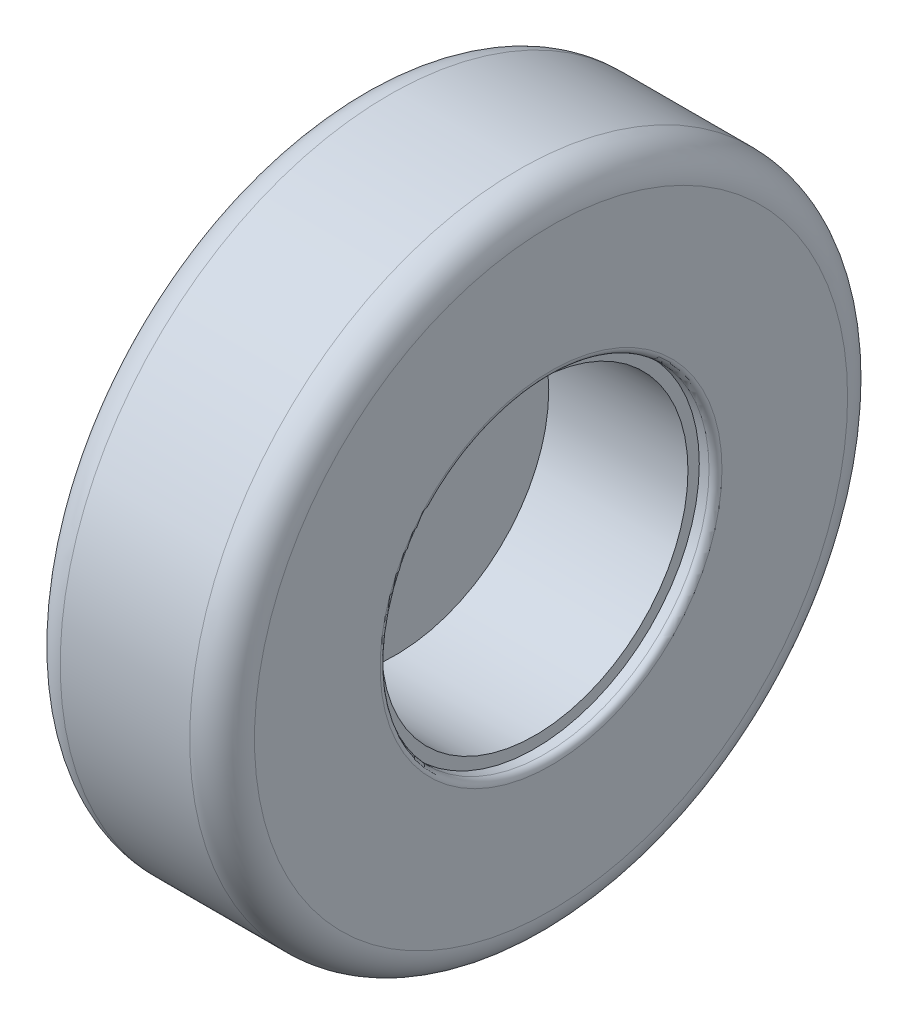
ISO-10303-21;
HEADER;
FILE_DESCRIPTION(('STEP AP214'),'2;1');
FILE_NAME('part.step','',(''),(''),'','','');
FILE_SCHEMA(('AUTOMOTIVE_DESIGN { 1 0 10303 214 1 1 1 1 }'));
ENDSEC;
DATA;
#1=APPLICATION_CONTEXT('core data for automotive mechanical design processes');
#2=APPLICATION_PROTOCOL_DEFINITION('international standard','automotive_design',2000,#1);
#3=PRODUCT_CONTEXT('',#1,'mechanical');
#4=PRODUCT('Part','Part','',(#3));
#5=PRODUCT_RELATED_PRODUCT_CATEGORY('part','',(#4));
#6=PRODUCT_DEFINITION_FORMATION('','',#4);
#7=PRODUCT_DEFINITION_CONTEXT('part definition',#1,'design');
#8=PRODUCT_DEFINITION('design','',#6,#7);
#9=PRODUCT_DEFINITION_SHAPE('','',#8);
#10=(LENGTH_UNIT() NAMED_UNIT(*) SI_UNIT(.MILLI.,.METRE.));
#11=(NAMED_UNIT(*) PLANE_ANGLE_UNIT() SI_UNIT($,.RADIAN.));
#12=(NAMED_UNIT(*) SI_UNIT($,.STERADIAN.) SOLID_ANGLE_UNIT());
#13=UNCERTAINTY_MEASURE_WITH_UNIT(LENGTH_MEASURE(1.E-05),#10,'distance_accuracy_value','');
#14=(GEOMETRIC_REPRESENTATION_CONTEXT(3) GLOBAL_UNCERTAINTY_ASSIGNED_CONTEXT((#13)) GLOBAL_UNIT_ASSIGNED_CONTEXT((#10,
#11,#12)) REPRESENTATION_CONTEXT('',''));
#15=CARTESIAN_POINT('',(0.,0.,0.));
#16=DIRECTION('',(0.,0.,1.));
#17=DIRECTION('',(1.,0.,0.));
#18=AXIS2_PLACEMENT_3D('',#15,#16,#17);
#19=CARTESIAN_POINT('',(12.,0.,0.));
#20=DIRECTION('',(1.,0.,0.));
#21=DIRECTION('',(0.,0.,-1.));
#22=AXIS2_PLACEMENT_3D('',#19,#20,#21);
#23=PLANE('',#22);
#24=CARTESIAN_POINT('',(12.,0.,0.));
#25=DIRECTION('',(1.,0.,0.));
#26=DIRECTION('',(0.,0.,-1.));
#27=AXIS2_PLACEMENT_3D('',#24,#25,#26);
#28=CIRCLE('',#27,7.625);
#29=CARTESIAN_POINT('',(12.,0.,-7.625));
#30=VERTEX_POINT('',#29);
#31=EDGE_CURVE('E69',#30,#30,#28,.T.);
#32=ORIENTED_EDGE('',*,*,#31,.F.);
#33=EDGE_LOOP('',(#32));
#34=FACE_BOUND('',#33,.T.);
#35=CARTESIAN_POINT('',(12.,0.,0.));
#36=DIRECTION('',(1.,0.,0.));
#37=DIRECTION('',(0.,0.,-1.));
#38=AXIS2_PLACEMENT_3D('',#35,#36,#37);
#39=CIRCLE('',#38,47.3);
#40=CARTESIAN_POINT('',(12.,0.,-47.3));
#41=VERTEX_POINT('',#40);
#42=EDGE_CURVE('E65',#41,#41,#39,.F.);
#43=ORIENTED_EDGE('',*,*,#42,.F.);
#44=EDGE_LOOP('',(#43));
#45=FACE_BOUND('',#44,.T.);
#46=ADVANCED_FACE('F33',(#34,#45),#23,.T.);
#47=CARTESIAN_POINT('',(5.,0.,0.));
#48=DIRECTION('',(1.,0.,0.));
#49=DIRECTION('',(0.,0.,-1.));
#50=AXIS2_PLACEMENT_3D('',#47,#48,#49);
#51=PLANE('',#50);
#52=CARTESIAN_POINT('',(5.,0.,0.));
#53=DIRECTION('',(1.,0.,0.));
#54=DIRECTION('',(0.,0.,-1.));
#55=AXIS2_PLACEMENT_3D('',#52,#53,#54);
#56=CIRCLE('',#55,50.8);
#57=CARTESIAN_POINT('',(5.,0.,-50.8));
#58=VERTEX_POINT('',#57);
#59=EDGE_CURVE('E66',#58,#58,#56,.T.);
#60=ORIENTED_EDGE('',*,*,#59,.F.);
#61=EDGE_LOOP('',(#60));
#62=FACE_BOUND('',#61,.T.);
#63=CARTESIAN_POINT('',(5.,0.,0.));
#64=DIRECTION('',(1.,0.,0.));
#65=DIRECTION('',(0.,0.,-1.));
#66=AXIS2_PLACEMENT_3D('',#63,#64,#65);
#67=CIRCLE('',#66,7.625);
#68=CARTESIAN_POINT('',(5.,0.,-7.625));
#69=VERTEX_POINT('',#68);
#70=EDGE_CURVE('E70',#69,#69,#67,.T.);
#71=ORIENTED_EDGE('',*,*,#70,.T.);
#72=EDGE_LOOP('',(#71));
#73=FACE_BOUND('',#72,.T.);
#74=ADVANCED_FACE('F106',(#62,#73),#51,.F.);
#75=CARTESIAN_POINT('',(12.,0.,0.));
#76=DIRECTION('',(-1.,0.,0.));
#77=DIRECTION('',(0.,0.,1.));
#78=AXIS2_PLACEMENT_3D('',#75,#76,#77);
#79=CYLINDRICAL_SURFACE('',#78,7.625);
#80=ORIENTED_EDGE('',*,*,#31,.T.);
#81=EDGE_LOOP('',(#80));
#82=FACE_BOUND('',#81,.T.);
#83=ORIENTED_EDGE('',*,*,#70,.F.);
#84=EDGE_LOOP('',(#83));
#85=FACE_BOUND('',#84,.T.);
#86=ADVANCED_FACE('F90',(#82,#85),#79,.F.);
#87=CARTESIAN_POINT('',(55.,0.,0.));
#88=DIRECTION('',(1.,0.,0.));
#89=DIRECTION('',(0.,0.,-1.));
#90=AXIS2_PLACEMENT_3D('',#87,#88,#89);
#91=PLANE('',#90);
#92=CARTESIAN_POINT('',(55.,0.,0.));
#93=DIRECTION('',(1.,0.,0.));
#94=DIRECTION('',(0.,0.,-1.));
#95=AXIS2_PLACEMENT_3D('',#92,#93,#94);
#96=CIRCLE('',#95,50.8);
#97=CARTESIAN_POINT('',(55.,0.,-50.8));
#98=VERTEX_POINT('',#97);
#99=EDGE_CURVE('E80',#98,#98,#96,.F.);
#100=ORIENTED_EDGE('',*,*,#99,.F.);
#101=EDGE_LOOP('',(#100));
#102=FACE_BOUND('',#101,.T.);
#103=CARTESIAN_POINT('',(55.,0.,0.));
#104=DIRECTION('',(1.,0.,0.));
#105=DIRECTION('',(0.,0.,-1.));
#106=AXIS2_PLACEMENT_3D('',#103,#104,#105);
#107=CIRCLE('',#106,47.3);
#108=CARTESIAN_POINT('',(55.,0.,-47.3));
#109=VERTEX_POINT('',#108);
#110=EDGE_CURVE('E73',#109,#109,#107,.T.);
#111=ORIENTED_EDGE('',*,*,#110,.F.);
#112=EDGE_LOOP('',(#111));
#113=FACE_BOUND('',#112,.T.);
#114=ADVANCED_FACE('F86',(#102,#113),#91,.T.);
#115=CARTESIAN_POINT('',(55.,0.,0.));
#116=DIRECTION('',(-1.,0.,0.));
#117=DIRECTION('',(0.,0.,1.));
#118=AXIS2_PLACEMENT_3D('',#115,#116,#117);
#119=CYLINDRICAL_SURFACE('',#118,47.3);
#120=ORIENTED_EDGE('',*,*,#42,.T.);
#121=EDGE_LOOP('',(#120));
#122=FACE_BOUND('',#121,.T.);
#123=ORIENTED_EDGE('',*,*,#110,.T.);
#124=EDGE_LOOP('',(#123));
#125=FACE_BOUND('',#124,.T.);
#126=ADVANCED_FACE('F89',(#122,#125),#119,.F.);
#127=CARTESIAN_POINT('',(60.,0.,0.));
#128=DIRECTION('',(-1.,0.,0.));
#129=DIRECTION('',(0.,0.,1.));
#130=AXIS2_PLACEMENT_3D('',#127,#128,#129);
#131=CYLINDRICAL_SURFACE('',#130,50.8);
#132=CARTESIAN_POINT('',(2.,0.,0.));
#133=DIRECTION('',(1.,0.,0.));
#134=DIRECTION('',(0.,0.,-1.));
#135=AXIS2_PLACEMENT_3D('',#132,#133,#134);
#136=CIRCLE('',#135,50.8);
#137=CARTESIAN_POINT('',(2.,0.,-50.8));
#138=VERTEX_POINT('',#137);
#139=EDGE_CURVE('E44',#138,#138,#136,.F.);
#140=ORIENTED_EDGE('',*,*,#139,.T.);
#141=EDGE_LOOP('',(#140));
#142=FACE_BOUND('',#141,.T.);
#143=ORIENTED_EDGE('',*,*,#59,.T.);
#144=EDGE_LOOP('',(#143));
#145=FACE_BOUND('',#144,.T.);
#146=ADVANCED_FACE('F95',(#142,#145),#131,.F.);
#147=CARTESIAN_POINT('',(60.,0.,0.));
#148=DIRECTION('',(1.,0.,0.));
#149=DIRECTION('',(0.,0.,-1.));
#150=AXIS2_PLACEMENT_3D('',#147,#148,#149);
#151=PLANE('',#150);
#152=CARTESIAN_POINT('',(60.,0.,0.));
#153=DIRECTION('',(1.,0.,0.));
#154=DIRECTION('',(0.,0.,-1.));
#155=AXIS2_PLACEMENT_3D('',#152,#153,#154);
#156=CIRCLE('',#155,52.8);
#157=CARTESIAN_POINT('',(60.,0.,-52.8));
#158=VERTEX_POINT('',#157);
#159=EDGE_CURVE('E10',#158,#158,#156,.F.);
#160=ORIENTED_EDGE('',*,*,#159,.T.);
#161=EDGE_LOOP('',(#160));
#162=FACE_BOUND('',#161,.T.);
#163=CARTESIAN_POINT('',(60.,0.,0.));
#164=DIRECTION('',(1.,0.,0.));
#165=DIRECTION('',(0.,0.,-1.));
#166=AXIS2_PLACEMENT_3D('',#163,#164,#165);
#167=CIRCLE('',#166,91.6);
#168=CARTESIAN_POINT('',(60.,0.,-91.6));
#169=VERTEX_POINT('',#168);
#170=EDGE_CURVE('E53',#169,#169,#167,.T.);
#171=ORIENTED_EDGE('',*,*,#170,.T.);
#172=EDGE_LOOP('',(#171));
#173=FACE_BOUND('',#172,.T.);
#174=ADVANCED_FACE('F101',(#162,#173),#151,.T.);
#175=CARTESIAN_POINT('',(0.,0.,0.));
#176=DIRECTION('',(1.,0.,0.));
#177=DIRECTION('',(0.,0.,-1.));
#178=AXIS2_PLACEMENT_3D('',#175,#176,#177);
#179=PLANE('',#178);
#180=CARTESIAN_POINT('',(0.,0.,0.));
#181=DIRECTION('',(1.,0.,0.));
#182=DIRECTION('',(0.,0.,-1.));
#183=AXIS2_PLACEMENT_3D('',#180,#181,#182);
#184=CIRCLE('',#183,52.8);
#185=CARTESIAN_POINT('',(0.,0.,-52.8));
#186=VERTEX_POINT('',#185);
#187=EDGE_CURVE('E48',#186,#186,#184,.T.);
#188=ORIENTED_EDGE('',*,*,#187,.T.);
#189=EDGE_LOOP('',(#188));
#190=FACE_BOUND('',#189,.T.);
#191=CARTESIAN_POINT('',(0.,0.,0.));
#192=DIRECTION('',(1.,0.,0.));
#193=DIRECTION('',(0.,0.,-1.));
#194=AXIS2_PLACEMENT_3D('',#191,#192,#193);
#195=CIRCLE('',#194,91.6);
#196=CARTESIAN_POINT('',(0.,0.,-91.6));
#197=VERTEX_POINT('',#196);
#198=EDGE_CURVE('E56',#197,#197,#195,.F.);
#199=ORIENTED_EDGE('',*,*,#198,.T.);
#200=EDGE_LOOP('',(#199));
#201=FACE_BOUND('',#200,.T.);
#202=ADVANCED_FACE('F136',(#190,#201),#179,.F.);
#203=CARTESIAN_POINT('',(60.,0.,0.));
#204=DIRECTION('',(-1.,0.,0.));
#205=DIRECTION('',(0.,0.,1.));
#206=AXIS2_PLACEMENT_3D('',#203,#204,#205);
#207=CYLINDRICAL_SURFACE('',#206,101.6);
#208=CARTESIAN_POINT('',(10.,0.,0.));
#209=DIRECTION('',(1.,0.,0.));
#210=DIRECTION('',(0.,0.,-1.));
#211=AXIS2_PLACEMENT_3D('',#208,#209,#210);
#212=CIRCLE('',#211,101.6);
#213=CARTESIAN_POINT('',(10.,0.,-101.6));
#214=VERTEX_POINT('',#213);
#215=EDGE_CURVE('E59',#214,#214,#212,.T.);
#216=ORIENTED_EDGE('',*,*,#215,.T.);
#217=EDGE_LOOP('',(#216));
#218=FACE_BOUND('',#217,.T.);
#219=CARTESIAN_POINT('',(50.,0.,0.));
#220=DIRECTION('',(1.,0.,0.));
#221=DIRECTION('',(0.,0.,-1.));
#222=AXIS2_PLACEMENT_3D('',#219,#220,#221);
#223=CIRCLE('',#222,101.6);
#224=CARTESIAN_POINT('',(50.,0.,-101.6));
#225=VERTEX_POINT('',#224);
#226=EDGE_CURVE('E62',#225,#225,#223,.F.);
#227=ORIENTED_EDGE('',*,*,#226,.T.);
#228=EDGE_LOOP('',(#227));
#229=FACE_BOUND('',#228,.T.);
#230=ADVANCED_FACE('F139',(#218,#229),#207,.T.);
#231=CARTESIAN_POINT('',(58.,0.,0.));
#232=DIRECTION('',(1.,0.,0.));
#233=DIRECTION('',(0.,0.,-1.));
#234=AXIS2_PLACEMENT_3D('',#231,#232,#233);
#235=CIRCLE('',#234,50.8);
#236=CARTESIAN_POINT('',(58.,0.,-50.8));
#237=VERTEX_POINT('',#236);
#238=EDGE_CURVE('E40',#237,#237,#235,.T.);
#239=ORIENTED_EDGE('',*,*,#238,.T.);
#240=EDGE_LOOP('',(#239));
#241=FACE_BOUND('',#240,.T.);
#242=ORIENTED_EDGE('',*,*,#99,.T.);
#243=EDGE_LOOP('',(#242));
#244=FACE_BOUND('',#243,.T.);
#245=ADVANCED_FACE('F84',(#241,#244),#131,.F.);
#246=CARTESIAN_POINT('',(10.,0.,0.));
#247=DIRECTION('',(1.,0.,0.));
#248=DIRECTION('',(0.,0.,-1.));
#249=AXIS2_PLACEMENT_3D('',#246,#247,#248);
#250=TOROIDAL_SURFACE('',#249,91.6,10.);
#251=ORIENTED_EDGE('',*,*,#198,.F.);
#252=EDGE_LOOP('',(#251));
#253=FACE_BOUND('',#252,.T.);
#254=ORIENTED_EDGE('',*,*,#215,.F.);
#255=EDGE_LOOP('',(#254));
#256=FACE_BOUND('',#255,.T.);
#257=ADVANCED_FACE('F118',(#253,#256),#250,.T.);
#258=CARTESIAN_POINT('',(50.,0.,0.));
#259=DIRECTION('',(1.,0.,0.));
#260=DIRECTION('',(0.,0.,-1.));
#261=AXIS2_PLACEMENT_3D('',#258,#259,#260);
#262=TOROIDAL_SURFACE('',#261,91.6,10.);
#263=ORIENTED_EDGE('',*,*,#226,.F.);
#264=EDGE_LOOP('',(#263));
#265=FACE_BOUND('',#264,.T.);
#266=ORIENTED_EDGE('',*,*,#170,.F.);
#267=EDGE_LOOP('',(#266));
#268=FACE_BOUND('',#267,.T.);
#269=ADVANCED_FACE('F121',(#265,#268),#262,.T.);
#270=CARTESIAN_POINT('',(2.,0.,0.));
#271=DIRECTION('',(1.,0.,0.));
#272=DIRECTION('',(0.,0.,-1.));
#273=AXIS2_PLACEMENT_3D('',#270,#271,#272);
#274=TOROIDAL_SURFACE('',#273,52.8,2.);
#275=ORIENTED_EDGE('',*,*,#139,.F.);
#276=EDGE_LOOP('',(#275));
#277=FACE_BOUND('',#276,.T.);
#278=ORIENTED_EDGE('',*,*,#187,.F.);
#279=EDGE_LOOP('',(#278));
#280=FACE_BOUND('',#279,.T.);
#281=ADVANCED_FACE('F124',(#277,#280),#274,.T.);
#282=CARTESIAN_POINT('',(58.,0.,0.));
#283=DIRECTION('',(1.,0.,0.));
#284=DIRECTION('',(0.,0.,-1.));
#285=AXIS2_PLACEMENT_3D('',#282,#283,#284);
#286=TOROIDAL_SURFACE('',#285,52.8,2.);
#287=ORIENTED_EDGE('',*,*,#159,.F.);
#288=EDGE_LOOP('',(#287));
#289=FACE_BOUND('',#288,.T.);
#290=ORIENTED_EDGE('',*,*,#238,.F.);
#291=EDGE_LOOP('',(#290));
#292=FACE_BOUND('',#291,.T.);
#293=ADVANCED_FACE('F35',(#289,#292),#286,.T.);
#294=CLOSED_SHELL('',(#46,#74,#86,#114,#126,#146,#174,#202,#230,#245,#257,#269,#281,#293));
#295=MANIFOLD_SOLID_BREP('B2',#294);
#296=ADVANCED_BREP_SHAPE_REPRESENTATION('',(#18,#295),#14);
#297=SHAPE_DEFINITION_REPRESENTATION(#9,#296);
ENDSEC;
END-ISO-10303-21;
